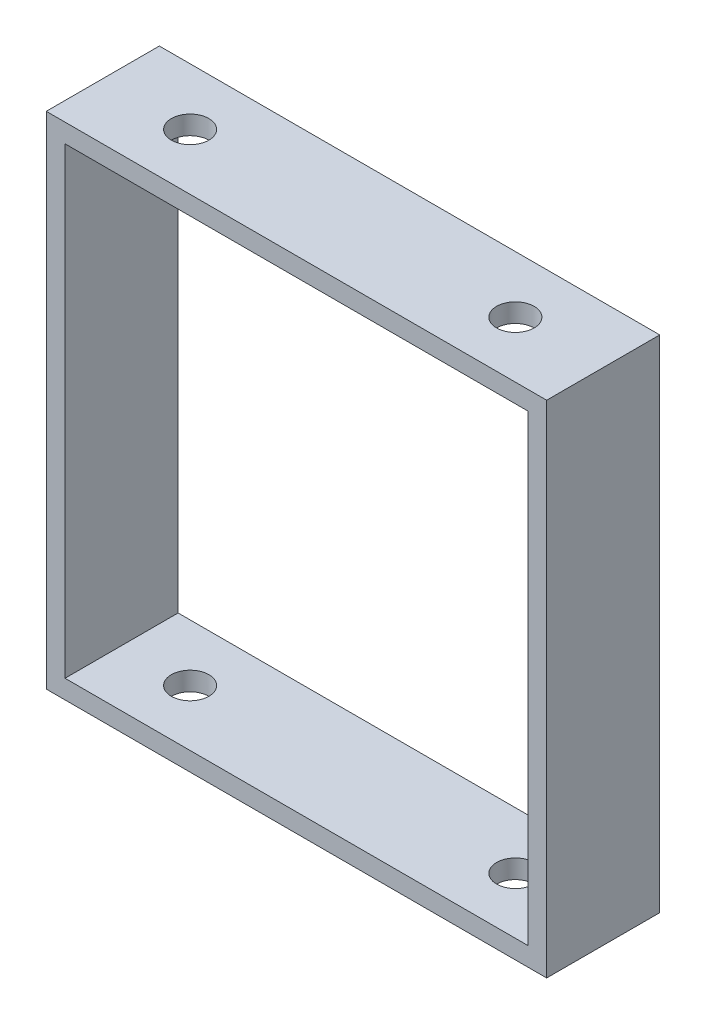
ISO-10303-21;
HEADER;
FILE_DESCRIPTION(('STEP AP214'),'2;1');
FILE_NAME('part.step','',(''),(''),'','','');
FILE_SCHEMA(('AUTOMOTIVE_DESIGN { 1 0 10303 214 1 1 1 1 }'));
ENDSEC;
DATA;
#1=APPLICATION_CONTEXT('core data for automotive mechanical design processes');
#2=APPLICATION_PROTOCOL_DEFINITION('international standard','automotive_design',2000,#1);
#3=PRODUCT_CONTEXT('',#1,'mechanical');
#4=PRODUCT('Part','Part','',(#3));
#5=PRODUCT_RELATED_PRODUCT_CATEGORY('part','',(#4));
#6=PRODUCT_DEFINITION_FORMATION('','',#4);
#7=PRODUCT_DEFINITION_CONTEXT('part definition',#1,'design');
#8=PRODUCT_DEFINITION('design','',#6,#7);
#9=PRODUCT_DEFINITION_SHAPE('','',#8);
#10=(LENGTH_UNIT() NAMED_UNIT(*) SI_UNIT(.MILLI.,.METRE.));
#11=(NAMED_UNIT(*) PLANE_ANGLE_UNIT() SI_UNIT($,.RADIAN.));
#12=(NAMED_UNIT(*) SI_UNIT($,.STERADIAN.) SOLID_ANGLE_UNIT());
#13=UNCERTAINTY_MEASURE_WITH_UNIT(LENGTH_MEASURE(1.E-05),#10,'distance_accuracy_value','');
#14=(GEOMETRIC_REPRESENTATION_CONTEXT(3) GLOBAL_UNCERTAINTY_ASSIGNED_CONTEXT((#13)) GLOBAL_UNIT_ASSIGNED_CONTEXT((#10,
#11,#12)) REPRESENTATION_CONTEXT('',''));
#15=CARTESIAN_POINT('',(0.,0.,0.));
#16=DIRECTION('',(0.,0.,1.));
#17=DIRECTION('',(1.,0.,0.));
#18=AXIS2_PLACEMENT_3D('',#15,#16,#17);
#19=CARTESIAN_POINT('',(63.5,63.5,28.702));
#20=DIRECTION('',(-1.,0.,0.));
#21=DIRECTION('',(0.,-1.,0.));
#22=AXIS2_PLACEMENT_3D('',#19,#20,#21);
#23=PLANE('',#22);
#24=DIRECTION('',(0.,1.,0.));
#25=VECTOR('',#24,1.);
#26=CARTESIAN_POINT('',(63.5,63.5,0.));
#27=LINE('',#26,#25);
#28=CARTESIAN_POINT('',(63.5,-63.5,0.));
#29=VERTEX_POINT('',#28);
#30=CARTESIAN_POINT('',(63.5,63.5,0.));
#31=VERTEX_POINT('',#30);
#32=EDGE_CURVE('E130',#29,#31,#27,.T.);
#33=ORIENTED_EDGE('',*,*,#32,.T.);
#34=DIRECTION('',(0.,0.,-1.));
#35=VECTOR('',#34,1.);
#36=CARTESIAN_POINT('',(63.5,63.5,28.702));
#37=LINE('',#36,#35);
#38=CARTESIAN_POINT('',(63.5,63.5,28.702));
#39=VERTEX_POINT('',#38);
#40=EDGE_CURVE('E11',#39,#31,#37,.T.);
#41=ORIENTED_EDGE('',*,*,#40,.F.);
#42=DIRECTION('',(0.,1.,0.));
#43=VECTOR('',#42,1.);
#44=CARTESIAN_POINT('',(63.5,63.5,28.702));
#45=LINE('',#44,#43);
#46=CARTESIAN_POINT('',(63.5,-63.5,28.702));
#47=VERTEX_POINT('',#46);
#48=EDGE_CURVE('E132',#47,#39,#45,.T.);
#49=ORIENTED_EDGE('',*,*,#48,.F.);
#50=DIRECTION('',(0.,0.,-1.));
#51=VECTOR('',#50,1.);
#52=CARTESIAN_POINT('',(63.5,-63.5,28.702));
#53=LINE('',#52,#51);
#54=EDGE_CURVE('E142',#47,#29,#53,.T.);
#55=ORIENTED_EDGE('',*,*,#54,.T.);
#56=EDGE_LOOP('',(#33,#41,#49,#55));
#57=FACE_BOUND('',#56,.T.);
#58=ADVANCED_FACE('F34',(#57),#23,.F.);
#59=CARTESIAN_POINT('',(-63.5,63.5,28.702));
#60=DIRECTION('',(0.,-1.,0.));
#61=DIRECTION('',(0.,0.,-1.));
#62=AXIS2_PLACEMENT_3D('',#59,#60,#61);
#63=PLANE('',#62);
#64=CARTESIAN_POINT('',(-41.275,63.5,14.4145));
#65=DIRECTION('',(0.,1.,0.));
#66=DIRECTION('',(0.,0.,1.));
#67=AXIS2_PLACEMENT_3D('',#64,#65,#66);
#68=CIRCLE('',#67,4.7625);
#69=CARTESIAN_POINT('',(-41.275,63.5,19.177));
#70=VERTEX_POINT('',#69);
#71=EDGE_CURVE('E225',#70,#70,#68,.T.);
#72=ORIENTED_EDGE('',*,*,#71,.F.);
#73=EDGE_LOOP('',(#72));
#74=FACE_BOUND('',#73,.T.);
#75=CARTESIAN_POINT('',(41.275,63.5,14.4145));
#76=DIRECTION('',(0.,1.,0.));
#77=DIRECTION('',(0.,0.,1.));
#78=AXIS2_PLACEMENT_3D('',#75,#76,#77);
#79=CIRCLE('',#78,4.7625);
#80=CARTESIAN_POINT('',(41.275,63.5,19.177));
#81=VERTEX_POINT('',#80);
#82=EDGE_CURVE('E165',#81,#81,#79,.T.);
#83=ORIENTED_EDGE('',*,*,#82,.F.);
#84=EDGE_LOOP('',(#83));
#85=FACE_BOUND('',#84,.T.);
#86=DIRECTION('',(-1.,0.,0.));
#87=VECTOR('',#86,1.);
#88=CARTESIAN_POINT('',(-63.5,63.5,0.));
#89=LINE('',#88,#87);
#90=CARTESIAN_POINT('',(-63.5,63.5,0.));
#91=VERTEX_POINT('',#90);
#92=EDGE_CURVE('E145',#31,#91,#89,.T.);
#93=ORIENTED_EDGE('',*,*,#92,.T.);
#94=DIRECTION('',(0.,0.,-1.));
#95=VECTOR('',#94,1.);
#96=CARTESIAN_POINT('',(-63.5,63.5,28.702));
#97=LINE('',#96,#95);
#98=CARTESIAN_POINT('',(-63.5,63.5,28.702));
#99=VERTEX_POINT('',#98);
#100=EDGE_CURVE('E42',#99,#91,#97,.T.);
#101=ORIENTED_EDGE('',*,*,#100,.F.);
#102=DIRECTION('',(-1.,0.,0.));
#103=VECTOR('',#102,1.);
#104=CARTESIAN_POINT('',(-63.5,63.5,28.702));
#105=LINE('',#104,#103);
#106=EDGE_CURVE('E135',#39,#99,#105,.T.);
#107=ORIENTED_EDGE('',*,*,#106,.F.);
#108=ORIENTED_EDGE('',*,*,#40,.T.);
#109=EDGE_LOOP('',(#93,#101,#107,#108));
#110=FACE_BOUND('',#109,.T.);
#111=ADVANCED_FACE('F204',(#74,#85,#110),#63,.F.);
#112=CARTESIAN_POINT('',(-63.5,63.5,28.702));
#113=DIRECTION('',(1.,0.,0.));
#114=DIRECTION('',(0.,1.,0.));
#115=AXIS2_PLACEMENT_3D('',#112,#113,#114);
#116=PLANE('',#115);
#117=DIRECTION('',(0.,-1.,0.));
#118=VECTOR('',#117,1.);
#119=CARTESIAN_POINT('',(-63.5,63.5,0.));
#120=LINE('',#119,#118);
#121=CARTESIAN_POINT('',(-63.5,-63.5,0.));
#122=VERTEX_POINT('',#121);
#123=EDGE_CURVE('E147',#91,#122,#120,.T.);
#124=ORIENTED_EDGE('',*,*,#123,.T.);
#125=DIRECTION('',(0.,0.,-1.));
#126=VECTOR('',#125,1.);
#127=CARTESIAN_POINT('',(-63.5,-63.5,28.702));
#128=LINE('',#127,#126);
#129=CARTESIAN_POINT('',(-63.5,-63.5,28.702));
#130=VERTEX_POINT('',#129);
#131=EDGE_CURVE('E152',#130,#122,#128,.T.);
#132=ORIENTED_EDGE('',*,*,#131,.F.);
#133=DIRECTION('',(0.,-1.,0.));
#134=VECTOR('',#133,1.);
#135=CARTESIAN_POINT('',(-63.5,63.5,28.702));
#136=LINE('',#135,#134);
#137=EDGE_CURVE('E138',#99,#130,#136,.T.);
#138=ORIENTED_EDGE('',*,*,#137,.F.);
#139=ORIENTED_EDGE('',*,*,#100,.T.);
#140=EDGE_LOOP('',(#124,#132,#138,#139));
#141=FACE_BOUND('',#140,.T.);
#142=ADVANCED_FACE('F201',(#141),#116,.F.);
#143=CARTESIAN_POINT('',(-63.5,-63.5,28.702));
#144=DIRECTION('',(0.,1.,0.));
#145=DIRECTION('',(0.,0.,1.));
#146=AXIS2_PLACEMENT_3D('',#143,#144,#145);
#147=PLANE('',#146);
#148=CARTESIAN_POINT('',(-41.275,-63.5,14.4145));
#149=DIRECTION('',(0.,1.,0.));
#150=DIRECTION('',(0.,0.,1.));
#151=AXIS2_PLACEMENT_3D('',#148,#149,#150);
#152=CIRCLE('',#151,4.7625);
#153=CARTESIAN_POINT('',(-41.275,-63.5,19.177));
#154=VERTEX_POINT('',#153);
#155=EDGE_CURVE('E298',#154,#154,#152,.F.);
#156=ORIENTED_EDGE('',*,*,#155,.F.);
#157=EDGE_LOOP('',(#156));
#158=FACE_BOUND('',#157,.T.);
#159=CARTESIAN_POINT('',(41.275,-63.5,14.4145));
#160=DIRECTION('',(0.,1.,0.));
#161=DIRECTION('',(0.,0.,1.));
#162=AXIS2_PLACEMENT_3D('',#159,#160,#161);
#163=CIRCLE('',#162,4.7625);
#164=CARTESIAN_POINT('',(41.275,-63.5,19.177));
#165=VERTEX_POINT('',#164);
#166=EDGE_CURVE('E159',#165,#165,#163,.F.);
#167=ORIENTED_EDGE('',*,*,#166,.F.);
#168=EDGE_LOOP('',(#167));
#169=FACE_BOUND('',#168,.T.);
#170=DIRECTION('',(1.,0.,0.));
#171=VECTOR('',#170,1.);
#172=CARTESIAN_POINT('',(-63.5,-63.5,0.));
#173=LINE('',#172,#171);
#174=EDGE_CURVE('E136',#122,#29,#173,.T.);
#175=ORIENTED_EDGE('',*,*,#174,.T.);
#176=ORIENTED_EDGE('',*,*,#54,.F.);
#177=DIRECTION('',(1.,0.,0.));
#178=VECTOR('',#177,1.);
#179=CARTESIAN_POINT('',(-63.5,-63.5,28.702));
#180=LINE('',#179,#178);
#181=EDGE_CURVE('E140',#130,#47,#180,.T.);
#182=ORIENTED_EDGE('',*,*,#181,.F.);
#183=ORIENTED_EDGE('',*,*,#131,.T.);
#184=EDGE_LOOP('',(#175,#176,#182,#183));
#185=FACE_BOUND('',#184,.T.);
#186=ADVANCED_FACE('F197',(#158,#169,#185),#147,.F.);
#187=CARTESIAN_POINT('',(0.,0.,28.702));
#188=DIRECTION('',(0.,0.,1.));
#189=DIRECTION('',(1.,0.,0.));
#190=AXIS2_PLACEMENT_3D('',#187,#188,#189);
#191=PLANE('',#190);
#192=DIRECTION('',(0.,1.,0.));
#193=VECTOR('',#192,1.);
#194=CARTESIAN_POINT('',(58.7375,58.7375,28.702));
#195=LINE('',#194,#193);
#196=CARTESIAN_POINT('',(58.7375,-58.7375,28.702));
#197=VERTEX_POINT('',#196);
#198=CARTESIAN_POINT('',(58.7375,58.7375,28.702));
#199=VERTEX_POINT('',#198);
#200=EDGE_CURVE('E50',#197,#199,#195,.T.);
#201=ORIENTED_EDGE('',*,*,#200,.F.);
#202=DIRECTION('',(1.,0.,0.));
#203=VECTOR('',#202,1.);
#204=CARTESIAN_POINT('',(-58.7375,-58.7375,28.702));
#205=LINE('',#204,#203);
#206=CARTESIAN_POINT('',(-58.7375,-58.7375,28.702));
#207=VERTEX_POINT('',#206);
#208=EDGE_CURVE('E119',#207,#197,#205,.T.);
#209=ORIENTED_EDGE('',*,*,#208,.F.);
#210=DIRECTION('',(0.,-1.,0.));
#211=VECTOR('',#210,1.);
#212=CARTESIAN_POINT('',(-58.7375,58.7375,28.702));
#213=LINE('',#212,#211);
#214=CARTESIAN_POINT('',(-58.7375,58.7375,28.702));
#215=VERTEX_POINT('',#214);
#216=EDGE_CURVE('E103',#215,#207,#213,.T.);
#217=ORIENTED_EDGE('',*,*,#216,.F.);
#218=DIRECTION('',(-1.,0.,0.));
#219=VECTOR('',#218,1.);
#220=CARTESIAN_POINT('',(-58.7375,58.7375,28.702));
#221=LINE('',#220,#219);
#222=EDGE_CURVE('E112',#199,#215,#221,.T.);
#223=ORIENTED_EDGE('',*,*,#222,.F.);
#224=EDGE_LOOP('',(#201,#209,#217,#223));
#225=FACE_BOUND('',#224,.T.);
#226=ORIENTED_EDGE('',*,*,#48,.T.);
#227=ORIENTED_EDGE('',*,*,#106,.T.);
#228=ORIENTED_EDGE('',*,*,#137,.T.);
#229=ORIENTED_EDGE('',*,*,#181,.T.);
#230=EDGE_LOOP('',(#226,#227,#228,#229));
#231=FACE_BOUND('',#230,.T.);
#232=ADVANCED_FACE('F116',(#225,#231),#191,.T.);
#233=CARTESIAN_POINT('',(0.,0.,0.));
#234=DIRECTION('',(0.,0.,1.));
#235=DIRECTION('',(1.,0.,0.));
#236=AXIS2_PLACEMENT_3D('',#233,#234,#235);
#237=PLANE('',#236);
#238=DIRECTION('',(-1.,0.,0.));
#239=VECTOR('',#238,1.);
#240=CARTESIAN_POINT('',(-58.7375,-58.7375,0.));
#241=LINE('',#240,#239);
#242=CARTESIAN_POINT('',(58.7375,-58.7375,0.));
#243=VERTEX_POINT('',#242);
#244=CARTESIAN_POINT('',(-58.7375,-58.7375,0.));
#245=VERTEX_POINT('',#244);
#246=EDGE_CURVE('E175',#243,#245,#241,.T.);
#247=ORIENTED_EDGE('',*,*,#246,.F.);
#248=DIRECTION('',(0.,-1.,0.));
#249=VECTOR('',#248,1.);
#250=CARTESIAN_POINT('',(58.7375,58.7375,0.));
#251=LINE('',#250,#249);
#252=CARTESIAN_POINT('',(58.7375,58.7375,0.));
#253=VERTEX_POINT('',#252);
#254=EDGE_CURVE('E131',#253,#243,#251,.T.);
#255=ORIENTED_EDGE('',*,*,#254,.F.);
#256=DIRECTION('',(1.,0.,0.));
#257=VECTOR('',#256,1.);
#258=CARTESIAN_POINT('',(-58.7375,58.7375,0.));
#259=LINE('',#258,#257);
#260=CARTESIAN_POINT('',(-58.7375,58.7375,0.));
#261=VERTEX_POINT('',#260);
#262=EDGE_CURVE('E128',#261,#253,#259,.T.);
#263=ORIENTED_EDGE('',*,*,#262,.F.);
#264=DIRECTION('',(0.,1.,0.));
#265=VECTOR('',#264,1.);
#266=CARTESIAN_POINT('',(-58.7375,58.7375,0.));
#267=LINE('',#266,#265);
#268=EDGE_CURVE('E106',#245,#261,#267,.T.);
#269=ORIENTED_EDGE('',*,*,#268,.F.);
#270=EDGE_LOOP('',(#247,#255,#263,#269));
#271=FACE_BOUND('',#270,.T.);
#272=ORIENTED_EDGE('',*,*,#32,.F.);
#273=ORIENTED_EDGE('',*,*,#174,.F.);
#274=ORIENTED_EDGE('',*,*,#123,.F.);
#275=ORIENTED_EDGE('',*,*,#92,.F.);
#276=EDGE_LOOP('',(#272,#273,#274,#275));
#277=FACE_BOUND('',#276,.T.);
#278=ADVANCED_FACE('F184',(#271,#277),#237,.F.);
#279=CARTESIAN_POINT('',(58.7375,58.7375,-166.134738239779));
#280=DIRECTION('',(1.,0.,0.));
#281=DIRECTION('',(0.,1.,0.));
#282=AXIS2_PLACEMENT_3D('',#279,#280,#281);
#283=PLANE('',#282);
#284=ORIENTED_EDGE('',*,*,#254,.T.);
#285=DIRECTION('',(0.,0.,1.));
#286=VECTOR('',#285,1.);
#287=CARTESIAN_POINT('',(58.7375,-58.7375,-166.134738239779));
#288=LINE('',#287,#286);
#289=EDGE_CURVE('E124',#243,#197,#288,.T.);
#290=ORIENTED_EDGE('',*,*,#289,.T.);
#291=ORIENTED_EDGE('',*,*,#200,.T.);
#292=DIRECTION('',(0.,0.,1.));
#293=VECTOR('',#292,1.);
#294=CARTESIAN_POINT('',(58.7375,58.7375,-166.134738239779));
#295=LINE('',#294,#293);
#296=EDGE_CURVE('E109',#253,#199,#295,.T.);
#297=ORIENTED_EDGE('',*,*,#296,.F.);
#298=EDGE_LOOP('',(#284,#290,#291,#297));
#299=FACE_BOUND('',#298,.T.);
#300=ADVANCED_FACE('F179',(#299),#283,.F.);
#301=CARTESIAN_POINT('',(-58.7375,-58.7375,-166.134738239779));
#302=DIRECTION('',(0.,-1.,0.));
#303=DIRECTION('',(0.,0.,-1.));
#304=AXIS2_PLACEMENT_3D('',#301,#302,#303);
#305=PLANE('',#304);
#306=CARTESIAN_POINT('',(-41.275,-58.7375,14.4145));
#307=DIRECTION('',(0.,-1.,0.));
#308=DIRECTION('',(0.,0.,-1.));
#309=AXIS2_PLACEMENT_3D('',#306,#307,#308);
#310=CIRCLE('',#309,4.7625);
#311=CARTESIAN_POINT('',(-41.275,-58.7375,9.65199999999999));
#312=VERTEX_POINT('',#311);
#313=EDGE_CURVE('E170',#312,#312,#310,.T.);
#314=ORIENTED_EDGE('',*,*,#313,.T.);
#315=EDGE_LOOP('',(#314));
#316=FACE_BOUND('',#315,.T.);
#317=CARTESIAN_POINT('',(41.275,-58.7375,14.4145));
#318=DIRECTION('',(0.,-1.,0.));
#319=DIRECTION('',(0.,0.,-1.));
#320=AXIS2_PLACEMENT_3D('',#317,#318,#319);
#321=CIRCLE('',#320,4.7625);
#322=CARTESIAN_POINT('',(41.275,-58.7375,9.65199999999999));
#323=VERTEX_POINT('',#322);
#324=EDGE_CURVE('E158',#323,#323,#321,.T.);
#325=ORIENTED_EDGE('',*,*,#324,.T.);
#326=EDGE_LOOP('',(#325));
#327=FACE_BOUND('',#326,.T.);
#328=ORIENTED_EDGE('',*,*,#246,.T.);
#329=DIRECTION('',(0.,0.,1.));
#330=VECTOR('',#329,1.);
#331=CARTESIAN_POINT('',(-58.7375,-58.7375,-166.134738239779));
#332=LINE('',#331,#330);
#333=EDGE_CURVE('E108',#245,#207,#332,.T.);
#334=ORIENTED_EDGE('',*,*,#333,.T.);
#335=ORIENTED_EDGE('',*,*,#208,.T.);
#336=ORIENTED_EDGE('',*,*,#289,.F.);
#337=EDGE_LOOP('',(#328,#334,#335,#336));
#338=FACE_BOUND('',#337,.T.);
#339=ADVANCED_FACE('F183',(#316,#327,#338),#305,.F.);
#340=CARTESIAN_POINT('',(-58.7375,58.7375,-166.134738239779));
#341=DIRECTION('',(-1.,0.,0.));
#342=DIRECTION('',(0.,-1.,0.));
#343=AXIS2_PLACEMENT_3D('',#340,#341,#342);
#344=PLANE('',#343);
#345=ORIENTED_EDGE('',*,*,#268,.T.);
#346=DIRECTION('',(0.,0.,1.));
#347=VECTOR('',#346,1.);
#348=CARTESIAN_POINT('',(-58.7375,58.7375,-166.134738239779));
#349=LINE('',#348,#347);
#350=EDGE_CURVE('E58',#261,#215,#349,.T.);
#351=ORIENTED_EDGE('',*,*,#350,.T.);
#352=ORIENTED_EDGE('',*,*,#216,.T.);
#353=ORIENTED_EDGE('',*,*,#333,.F.);
#354=EDGE_LOOP('',(#345,#351,#352,#353));
#355=FACE_BOUND('',#354,.T.);
#356=ADVANCED_FACE('F100',(#355),#344,.F.);
#357=CARTESIAN_POINT('',(-58.7375,58.7375,-166.134738239779));
#358=DIRECTION('',(0.,1.,0.));
#359=DIRECTION('',(0.,0.,1.));
#360=AXIS2_PLACEMENT_3D('',#357,#358,#359);
#361=PLANE('',#360);
#362=CARTESIAN_POINT('',(-41.275,58.7375,14.4145));
#363=DIRECTION('',(0.,1.,0.));
#364=DIRECTION('',(0.,0.,1.));
#365=AXIS2_PLACEMENT_3D('',#362,#363,#364);
#366=CIRCLE('',#365,4.7625);
#367=CARTESIAN_POINT('',(-41.275,58.7375,19.177));
#368=VERTEX_POINT('',#367);
#369=EDGE_CURVE('E37',#368,#368,#366,.T.);
#370=ORIENTED_EDGE('',*,*,#369,.T.);
#371=EDGE_LOOP('',(#370));
#372=FACE_BOUND('',#371,.T.);
#373=CARTESIAN_POINT('',(41.275,58.7375,14.4145));
#374=DIRECTION('',(0.,1.,0.));
#375=DIRECTION('',(0.,0.,1.));
#376=AXIS2_PLACEMENT_3D('',#373,#374,#375);
#377=CIRCLE('',#376,4.7625);
#378=CARTESIAN_POINT('',(41.275,58.7375,19.177));
#379=VERTEX_POINT('',#378);
#380=EDGE_CURVE('E156',#379,#379,#377,.T.);
#381=ORIENTED_EDGE('',*,*,#380,.T.);
#382=EDGE_LOOP('',(#381));
#383=FACE_BOUND('',#382,.T.);
#384=ORIENTED_EDGE('',*,*,#262,.T.);
#385=ORIENTED_EDGE('',*,*,#296,.T.);
#386=ORIENTED_EDGE('',*,*,#222,.T.);
#387=ORIENTED_EDGE('',*,*,#350,.F.);
#388=EDGE_LOOP('',(#384,#385,#386,#387));
#389=FACE_BOUND('',#388,.T.);
#390=ADVANCED_FACE('F113',(#372,#383,#389),#361,.F.);
#391=CARTESIAN_POINT('',(41.275,-76.9703841816038,14.4145));
#392=DIRECTION('',(0.,1.,0.));
#393=DIRECTION('',(0.,0.,1.));
#394=AXIS2_PLACEMENT_3D('',#391,#392,#393);
#395=CYLINDRICAL_SURFACE('',#394,4.7625);
#396=ORIENTED_EDGE('',*,*,#82,.T.);
#397=EDGE_LOOP('',(#396));
#398=FACE_BOUND('',#397,.T.);
#399=ORIENTED_EDGE('',*,*,#380,.F.);
#400=EDGE_LOOP('',(#399));
#401=FACE_BOUND('',#400,.T.);
#402=ADVANCED_FACE('F228',(#398,#401),#395,.F.);
#403=ORIENTED_EDGE('',*,*,#166,.T.);
#404=EDGE_LOOP('',(#403));
#405=FACE_BOUND('',#404,.T.);
#406=ORIENTED_EDGE('',*,*,#324,.F.);
#407=EDGE_LOOP('',(#406));
#408=FACE_BOUND('',#407,.T.);
#409=ADVANCED_FACE('F231',(#405,#408),#395,.F.);
#410=CARTESIAN_POINT('',(-41.275,-76.9703841816038,14.4145));
#411=DIRECTION('',(0.,1.,0.));
#412=DIRECTION('',(0.,0.,1.));
#413=AXIS2_PLACEMENT_3D('',#410,#411,#412);
#414=CYLINDRICAL_SURFACE('',#413,4.7625);
#415=ORIENTED_EDGE('',*,*,#71,.T.);
#416=EDGE_LOOP('',(#415));
#417=FACE_BOUND('',#416,.T.);
#418=ORIENTED_EDGE('',*,*,#369,.F.);
#419=EDGE_LOOP('',(#418));
#420=FACE_BOUND('',#419,.T.);
#421=ADVANCED_FACE('F237',(#417,#420),#414,.F.);
#422=ORIENTED_EDGE('',*,*,#155,.T.);
#423=EDGE_LOOP('',(#422));
#424=FACE_BOUND('',#423,.T.);
#425=ORIENTED_EDGE('',*,*,#313,.F.);
#426=EDGE_LOOP('',(#425));
#427=FACE_BOUND('',#426,.T.);
#428=ADVANCED_FACE('F242',(#424,#427),#414,.F.);
#429=CLOSED_SHELL('',(#58,#111,#142,#186,#232,#278,#300,#339,#356,#390,#402,#409,#421,#428));
#430=MANIFOLD_SOLID_BREP('B2',#429);
#431=ADVANCED_BREP_SHAPE_REPRESENTATION('',(#18,#430),#14);
#432=SHAPE_DEFINITION_REPRESENTATION(#9,#431);
ENDSEC;
END-ISO-10303-21;
